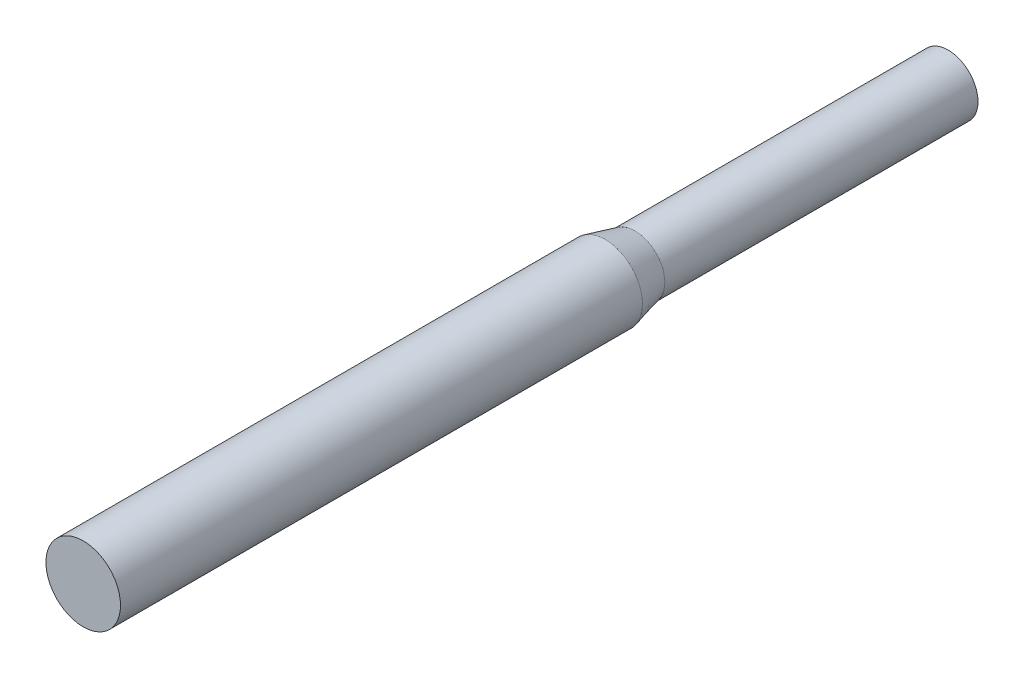
ISO-10303-21;
HEADER;
FILE_DESCRIPTION(('STEP AP214'),'2;1');
FILE_NAME('part.step','',(''),(''),'','','');
FILE_SCHEMA(('AUTOMOTIVE_DESIGN { 1 0 10303 214 1 1 1 1 }'));
ENDSEC;
DATA;
#1=APPLICATION_CONTEXT('core data for automotive mechanical design processes');
#2=APPLICATION_PROTOCOL_DEFINITION('international standard','automotive_design',2000,#1);
#3=PRODUCT_CONTEXT('',#1,'mechanical');
#4=PRODUCT('Part','Part','',(#3));
#5=PRODUCT_RELATED_PRODUCT_CATEGORY('part','',(#4));
#6=PRODUCT_DEFINITION_FORMATION('','',#4);
#7=PRODUCT_DEFINITION_CONTEXT('part definition',#1,'design');
#8=PRODUCT_DEFINITION('design','',#6,#7);
#9=PRODUCT_DEFINITION_SHAPE('','',#8);
#10=(LENGTH_UNIT() NAMED_UNIT(*) SI_UNIT(.MILLI.,.METRE.));
#11=(NAMED_UNIT(*) PLANE_ANGLE_UNIT() SI_UNIT($,.RADIAN.));
#12=(NAMED_UNIT(*) SI_UNIT($,.STERADIAN.) SOLID_ANGLE_UNIT());
#13=UNCERTAINTY_MEASURE_WITH_UNIT(LENGTH_MEASURE(1.E-05),#10,'distance_accuracy_value','');
#14=(GEOMETRIC_REPRESENTATION_CONTEXT(3) GLOBAL_UNCERTAINTY_ASSIGNED_CONTEXT((#13)) GLOBAL_UNIT_ASSIGNED_CONTEXT((#10,
#11,#12)) REPRESENTATION_CONTEXT('',''));
#15=CARTESIAN_POINT('',(0.,0.,0.));
#16=DIRECTION('',(0.,0.,1.));
#17=DIRECTION('',(1.,0.,0.));
#18=AXIS2_PLACEMENT_3D('',#15,#16,#17);
#19=CARTESIAN_POINT('',(0.,0.,23.));
#20=DIRECTION('',(0.,0.,-1.));
#21=DIRECTION('',(-1.,0.,0.));
#22=AXIS2_PLACEMENT_3D('',#19,#20,#21);
#23=CYLINDRICAL_SURFACE('',#22,2.);
#24=CARTESIAN_POINT('',(0.,0.,21.));
#25=DIRECTION('',(0.,0.,1.));
#26=DIRECTION('',(1.,0.,0.));
#27=AXIS2_PLACEMENT_3D('',#24,#25,#26);
#28=CIRCLE('',#27,2.);
#29=CARTESIAN_POINT('',(2.,0.,21.));
#30=VERTEX_POINT('',#29);
#31=EDGE_CURVE('E10',#30,#30,#28,.F.);
#32=ORIENTED_EDGE('',*,*,#31,.T.);
#33=EDGE_LOOP('',(#32));
#34=FACE_BOUND('',#33,.T.);
#35=CARTESIAN_POINT('',(0.,0.,0.));
#36=DIRECTION('',(0.,0.,1.));
#37=DIRECTION('',(1.,0.,0.));
#38=AXIS2_PLACEMENT_3D('',#35,#36,#37);
#39=CIRCLE('',#38,2.);
#40=CARTESIAN_POINT('',(2.,0.,0.));
#41=VERTEX_POINT('',#40);
#42=EDGE_CURVE('E57',#41,#41,#39,.T.);
#43=ORIENTED_EDGE('',*,*,#42,.T.);
#44=EDGE_LOOP('',(#43));
#45=FACE_BOUND('',#44,.T.);
#46=ADVANCED_FACE('F43',(#34,#45),#23,.T.);
#47=CARTESIAN_POINT('',(0.,0.,0.));
#48=DIRECTION('',(0.,0.,1.));
#49=DIRECTION('',(1.,0.,0.));
#50=AXIS2_PLACEMENT_3D('',#47,#48,#49);
#51=PLANE('',#50);
#52=ORIENTED_EDGE('',*,*,#42,.F.);
#53=EDGE_LOOP('',(#52));
#54=FACE_BOUND('',#53,.T.);
#55=ADVANCED_FACE('F78',(#54),#51,.F.);
#56=CARTESIAN_POINT('',(0.,0.,58.));
#57=DIRECTION('',(0.,0.,-1.));
#58=DIRECTION('',(-1.,0.,0.));
#59=AXIS2_PLACEMENT_3D('',#56,#57,#58);
#60=CYLINDRICAL_SURFACE('',#59,2.5);
#61=CARTESIAN_POINT('',(0.,0.,58.));
#62=DIRECTION('',(0.,0.,1.));
#63=DIRECTION('',(1.,0.,0.));
#64=AXIS2_PLACEMENT_3D('',#61,#62,#63);
#65=CIRCLE('',#64,2.5);
#66=CARTESIAN_POINT('',(2.5,0.,58.));
#67=VERTEX_POINT('',#66);
#68=EDGE_CURVE('E62',#67,#67,#65,.T.);
#69=ORIENTED_EDGE('',*,*,#68,.F.);
#70=EDGE_LOOP('',(#69));
#71=FACE_BOUND('',#70,.T.);
#72=CARTESIAN_POINT('',(0.,0.,23.));
#73=DIRECTION('',(0.,0.,1.));
#74=DIRECTION('',(1.,0.,0.));
#75=AXIS2_PLACEMENT_3D('',#72,#73,#74);
#76=CIRCLE('',#75,2.5);
#77=CARTESIAN_POINT('',(2.5,0.,23.));
#78=VERTEX_POINT('',#77);
#79=EDGE_CURVE('E65',#78,#78,#76,.T.);
#80=ORIENTED_EDGE('',*,*,#79,.T.);
#81=EDGE_LOOP('',(#80));
#82=FACE_BOUND('',#81,.T.);
#83=ADVANCED_FACE('F75',(#71,#82),#60,.T.);
#84=CARTESIAN_POINT('',(0.,0.,58.));
#85=DIRECTION('',(0.,0.,1.));
#86=DIRECTION('',(1.,0.,0.));
#87=AXIS2_PLACEMENT_3D('',#84,#85,#86);
#88=PLANE('',#87);
#89=ORIENTED_EDGE('',*,*,#68,.T.);
#90=EDGE_LOOP('',(#89));
#91=FACE_BOUND('',#90,.T.);
#92=ADVANCED_FACE('F73',(#91),#88,.T.);
#93=CARTESIAN_POINT('',(0.,0.,23.));
#94=DIRECTION('',(0.,0.,1.));
#95=DIRECTION('',(1.,0.,0.));
#96=AXIS2_PLACEMENT_3D('',#93,#94,#95);
#97=PLANE('',#96);
#98=CARTESIAN_POINT('',(0.,0.,23.));
#99=DIRECTION('',(0.,0.,1.));
#100=DIRECTION('',(1.,0.,0.));
#101=AXIS2_PLACEMENT_3D('',#98,#99,#100);
#102=CIRCLE('',#101,2.49865600568638);
#103=CARTESIAN_POINT('',(2.49865600568638,0.,23.));
#104=VERTEX_POINT('',#103);
#105=EDGE_CURVE('E52',#104,#104,#102,.T.);
#106=ORIENTED_EDGE('',*,*,#105,.T.);
#107=EDGE_LOOP('',(#106));
#108=FACE_BOUND('',#107,.T.);
#109=ORIENTED_EDGE('',*,*,#79,.F.);
#110=EDGE_LOOP('',(#109));
#111=FACE_BOUND('',#110,.T.);
#112=ADVANCED_FACE('F82',(#108,#111),#97,.F.);
#113=CARTESIAN_POINT('',(0.,0.,23.));
#114=DIRECTION('',(0.,0.,1.));
#115=DIRECTION('',(1.,0.,0.));
#116=AXIS2_PLACEMENT_3D('',#113,#114,#115);
#117=CONICAL_SURFACE('',#116,2.49865600568638,0.244346095279211);
#118=ORIENTED_EDGE('',*,*,#31,.F.);
#119=EDGE_LOOP('',(#118));
#120=FACE_BOUND('',#119,.T.);
#121=ORIENTED_EDGE('',*,*,#105,.F.);
#122=EDGE_LOOP('',(#121));
#123=FACE_BOUND('',#122,.T.);
#124=ADVANCED_FACE('F46',(#120,#123),#117,.T.);
#125=CLOSED_SHELL('',(#46,#55,#83,#92,#112,#124));
#126=MANIFOLD_SOLID_BREP('B2',#125);
#127=ADVANCED_BREP_SHAPE_REPRESENTATION('',(#18,#126),#14);
#128=SHAPE_DEFINITION_REPRESENTATION(#9,#127);
ENDSEC;
END-ISO-10303-21;
